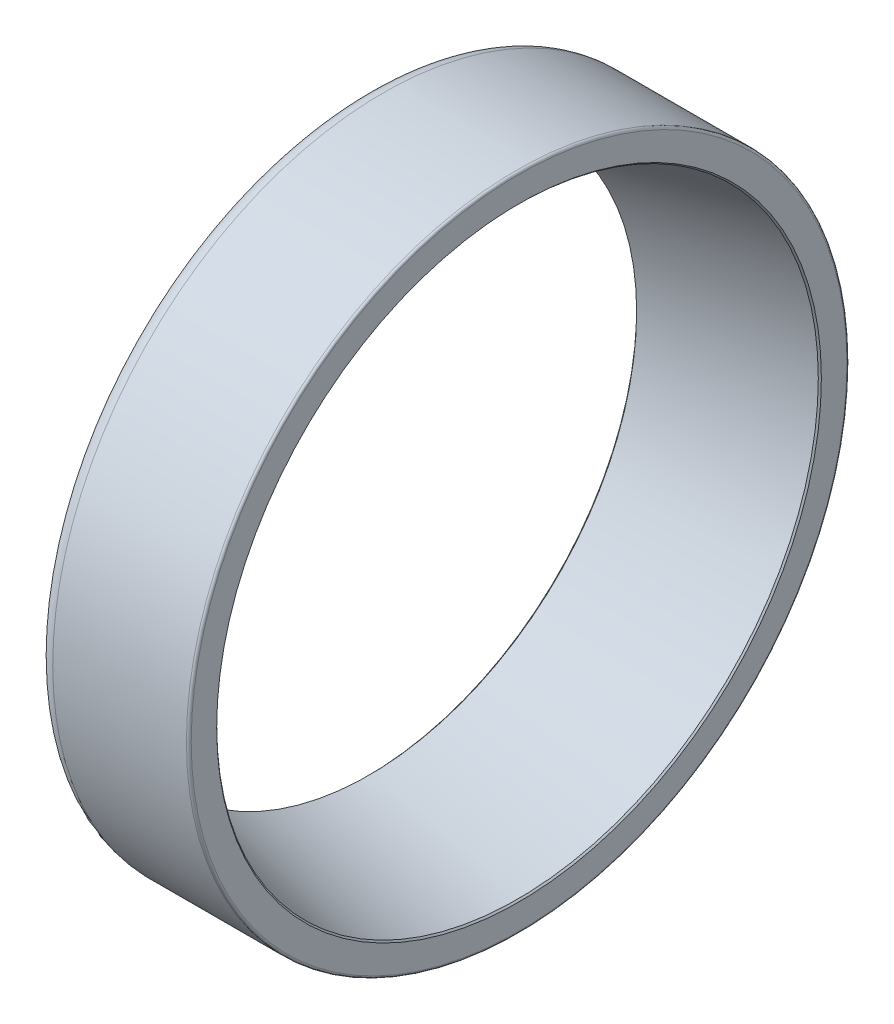
ISO-10303-21;
HEADER;
FILE_DESCRIPTION(('STEP AP214'),'2;1');
FILE_NAME('part.step','',(''),(''),'','','');
FILE_SCHEMA(('AUTOMOTIVE_DESIGN { 1 0 10303 214 1 1 1 1 }'));
ENDSEC;
DATA;
#1=APPLICATION_CONTEXT('core data for automotive mechanical design processes');
#2=APPLICATION_PROTOCOL_DEFINITION('international standard','automotive_design',2000,#1);
#3=PRODUCT_CONTEXT('',#1,'mechanical');
#4=PRODUCT('Part','Part','',(#3));
#5=PRODUCT_RELATED_PRODUCT_CATEGORY('part','',(#4));
#6=PRODUCT_DEFINITION_FORMATION('','',#4);
#7=PRODUCT_DEFINITION_CONTEXT('part definition',#1,'design');
#8=PRODUCT_DEFINITION('design','',#6,#7);
#9=PRODUCT_DEFINITION_SHAPE('','',#8);
#10=(LENGTH_UNIT() NAMED_UNIT(*) SI_UNIT(.MILLI.,.METRE.));
#11=(NAMED_UNIT(*) PLANE_ANGLE_UNIT() SI_UNIT($,.RADIAN.));
#12=(NAMED_UNIT(*) SI_UNIT($,.STERADIAN.) SOLID_ANGLE_UNIT());
#13=UNCERTAINTY_MEASURE_WITH_UNIT(LENGTH_MEASURE(1.E-05),#10,'distance_accuracy_value','');
#14=(GEOMETRIC_REPRESENTATION_CONTEXT(3) GLOBAL_UNCERTAINTY_ASSIGNED_CONTEXT((#13)) GLOBAL_UNIT_ASSIGNED_CONTEXT((#10,
#11,#12)) REPRESENTATION_CONTEXT('',''));
#15=CARTESIAN_POINT('',(0.,0.,0.));
#16=DIRECTION('',(0.,0.,1.));
#17=DIRECTION('',(1.,0.,0.));
#18=AXIS2_PLACEMENT_3D('',#15,#16,#17);
#19=CARTESIAN_POINT('',(18.9209032866378,-2.22044604925031E-13,0.));
#20=DIRECTION('',(1.,0.,0.));
#21=DIRECTION('',(0.,0.,-1.));
#22=AXIS2_PLACEMENT_3D('',#19,#20,#21);
#23=CONICAL_SURFACE('',#22,37.829903286638,0.219588317783418);
#24=CARTESIAN_POINT('',(0.245260906757583,-2.22044604925031E-13,0.));
#25=DIRECTION('',(-1.,0.,0.));
#26=DIRECTION('',(0.,0.,1.));
#27=AXIS2_PLACEMENT_3D('',#24,#25,#26);
#28=CIRCLE('',#27,33.661739093242);
#29=CARTESIAN_POINT('',(0.245260906757588,-2.36059119096372E-13,33.661739093242));
#30=VERTEX_POINT('',#29);
#31=EDGE_CURVE('E65',#30,#30,#28,.T.);
#32=ORIENTED_EDGE('',*,*,#31,.T.);
#33=EDGE_LOOP('',(#32));
#34=FACE_BOUND('',#33,.T.);
#35=CARTESIAN_POINT('',(18.9209032866378,-2.22044604925031E-13,0.));
#36=DIRECTION('',(1.,0.,0.));
#37=DIRECTION('',(0.,0.,-1.));
#38=AXIS2_PLACEMENT_3D('',#35,#36,#37);
#39=CIRCLE('',#38,37.829903286638);
#40=CARTESIAN_POINT('',(18.9209032866378,-2.06294743806968E-13,-37.829903286638));
#41=VERTEX_POINT('',#40);
#42=EDGE_CURVE('E203',#41,#41,#39,.T.);
#43=ORIENTED_EDGE('',*,*,#42,.T.);
#44=EDGE_LOOP('',(#43));
#45=FACE_BOUND('',#44,.T.);
#46=ADVANCED_FACE('F17',(#34,#45),#23,.F.);
#47=CARTESIAN_POINT('',(19.1139999999999,0.,2.22044604925031E-13));
#48=DIRECTION('',(1.,0.,0.));
#49=DIRECTION('',(0.,0.,-1.));
#50=AXIS2_PLACEMENT_3D('',#47,#48,#49);
#51=CONICAL_SURFACE('',#50,38.023,0.785398163397448);
#52=CARTESIAN_POINT('',(19.1139999999999,0.,2.22044604925031E-13));
#53=DIRECTION('',(1.,0.,0.));
#54=DIRECTION('',(0.,0.,-1.));
#55=AXIS2_PLACEMENT_3D('',#52,#53,#54);
#56=CIRCLE('',#55,38.023);
#57=CARTESIAN_POINT('',(19.1139999999998,0.,-38.0229999999998));
#58=VERTEX_POINT('',#57);
#59=EDGE_CURVE('E205',#58,#58,#56,.T.);
#60=ORIENTED_EDGE('',*,*,#59,.T.);
#61=EDGE_LOOP('',(#60));
#62=FACE_BOUND('',#61,.T.);
#63=ORIENTED_EDGE('',*,*,#42,.F.);
#64=EDGE_LOOP('',(#63));
#65=FACE_BOUND('',#64,.T.);
#66=ADVANCED_FACE('F155',(#62,#65),#51,.F.);
#67=CARTESIAN_POINT('',(0.,0.,0.));
#68=DIRECTION('',(-1.,0.,0.));
#69=DIRECTION('',(0.,0.,1.));
#70=AXIS2_PLACEMENT_3D('',#67,#68,#69);
#71=CONICAL_SURFACE('',#70,33.907,0.785398163397632);
#72=ORIENTED_EDGE('',*,*,#31,.F.);
#73=EDGE_LOOP('',(#72));
#74=FACE_BOUND('',#73,.T.);
#75=CARTESIAN_POINT('',(0.,0.,0.));
#76=DIRECTION('',(-1.,0.,0.));
#77=DIRECTION('',(0.,0.,1.));
#78=AXIS2_PLACEMENT_3D('',#75,#76,#77);
#79=CIRCLE('',#78,33.907);
#80=CARTESIAN_POINT('',(0.,0.,33.907));
#81=VERTEX_POINT('',#80);
#82=EDGE_CURVE('E52',#81,#81,#79,.T.);
#83=ORIENTED_EDGE('',*,*,#82,.T.);
#84=EDGE_LOOP('',(#83));
#85=FACE_BOUND('',#84,.T.);
#86=ADVANCED_FACE('F148',(#74,#85),#71,.F.);
#87=CARTESIAN_POINT('',(19.1139999999995,38.0230000000001,6.66133814775094E-13));
#88=DIRECTION('',(-1.,0.,0.));
#89=DIRECTION('',(0.,0.,1.));
#90=AXIS2_PLACEMENT_3D('',#87,#88,#89);
#91=PLANE('',#90);
#92=ORIENTED_EDGE('',*,*,#59,.F.);
#93=EDGE_LOOP('',(#92));
#94=FACE_BOUND('',#93,.T.);
#95=CARTESIAN_POINT('',(19.1139999999994,0.,2.22110683733828E-13));
#96=DIRECTION('',(-1.,0.,0.));
#97=DIRECTION('',(0.,0.,-1.));
#98=AXIS2_PLACEMENT_3D('',#95,#96,#97);
#99=CIRCLE('',#98,41.2289999999996);
#100=CARTESIAN_POINT('',(19.1139999999999,2.22044604925031E-13,-41.229));
#101=VERTEX_POINT('',#100);
#102=CARTESIAN_POINT('',(19.1139999999996,6.66133814775094E-13,41.2290000000002));
#103=VERTEX_POINT('',#102);
#104=EDGE_CURVE('E48',#101,#103,#99,.T.);
#105=ORIENTED_EDGE('',*,*,#104,.F.);
#106=CARTESIAN_POINT('',(19.1139999999994,0.,2.22110683733828E-13));
#107=DIRECTION('',(-1.,0.,0.));
#108=DIRECTION('',(0.,0.,1.));
#109=AXIS2_PLACEMENT_3D('',#106,#107,#108);
#110=CIRCLE('',#109,41.2289999999997);
#111=EDGE_CURVE('E45',#103,#101,#110,.T.);
#112=ORIENTED_EDGE('',*,*,#111,.F.);
#113=EDGE_LOOP('',(#105,#112));
#114=FACE_BOUND('',#113,.T.);
#115=ADVANCED_FACE('F50',(#94,#114),#91,.F.);
#116=CARTESIAN_POINT('',(-1.11022302462516E-13,39.5290000000001,2.22044604925031E-13));
#117=DIRECTION('',(1.,0.,0.));
#118=DIRECTION('',(0.,0.,-1.));
#119=AXIS2_PLACEMENT_3D('',#116,#117,#118);
#120=PLANE('',#119);
#121=CARTESIAN_POINT('',(-3.92914867308747E-13,0.,0.));
#122=DIRECTION('',(1.,0.,0.));
#123=DIRECTION('',(0.,0.,1.));
#124=AXIS2_PLACEMENT_3D('',#121,#122,#123);
#125=CIRCLE('',#124,39.5290000000001);
#126=CARTESIAN_POINT('',(-6.66133814775094E-13,4.44089209850063E-13,39.5290000000001));
#127=VERTEX_POINT('',#126);
#128=CARTESIAN_POINT('',(-2.22044604925031E-13,6.66133814775094E-13,-39.5289999999997));
#129=VERTEX_POINT('',#128);
#130=EDGE_CURVE('E36',#127,#129,#125,.T.);
#131=ORIENTED_EDGE('',*,*,#130,.F.);
#132=CARTESIAN_POINT('',(-3.94649590784724E-13,0.,0.));
#133=DIRECTION('',(1.,0.,0.));
#134=DIRECTION('',(0.,0.,-1.));
#135=AXIS2_PLACEMENT_3D('',#132,#133,#134);
#136=CIRCLE('',#135,39.529);
#137=EDGE_CURVE('E56',#129,#127,#136,.T.);
#138=ORIENTED_EDGE('',*,*,#137,.F.);
#139=EDGE_LOOP('',(#131,#138));
#140=FACE_BOUND('',#139,.T.);
#141=ORIENTED_EDGE('',*,*,#82,.F.);
#142=EDGE_LOOP('',(#141));
#143=FACE_BOUND('',#142,.T.);
#144=ADVANCED_FACE('F78',(#140,#143),#120,.F.);
#145=CARTESIAN_POINT('',(18.8139999999996,0.,2.22044604925031E-13));
#146=DIRECTION('',(-1.,0.,0.));
#147=DIRECTION('',(0.,0.,1.));
#148=AXIS2_PLACEMENT_3D('',#145,#146,#147);
#149=TOROIDAL_SURFACE('',#148,41.2289999999997,0.299999999999882);
#150=CARTESIAN_POINT('',(18.814,0.,-2.22044604925031E-13));
#151=DIRECTION('',(-1.,0.,0.));
#152=DIRECTION('',(0.,0.,1.));
#153=AXIS2_PLACEMENT_3D('',#150,#151,#152);
#154=CIRCLE('',#153,41.529);
#155=CARTESIAN_POINT('',(18.814,0.,41.5289999999998));
#156=VERTEX_POINT('',#155);
#157=EDGE_CURVE('E28',#156,#156,#154,.T.);
#158=ORIENTED_EDGE('',*,*,#157,.F.);
#159=EDGE_LOOP('',(#158));
#160=FACE_BOUND('',#159,.T.);
#161=ORIENTED_EDGE('',*,*,#111,.T.);
#162=ORIENTED_EDGE('',*,*,#104,.T.);
#163=EDGE_LOOP('',(#161,#162));
#164=FACE_BOUND('',#163,.T.);
#165=ADVANCED_FACE('F55',(#160,#164),#149,.T.);
#166=CARTESIAN_POINT('',(1.99999999999979,0.,0.));
#167=DIRECTION('',(-1.,0.,0.));
#168=DIRECTION('',(0.,0.,1.));
#169=AXIS2_PLACEMENT_3D('',#166,#167,#168);
#170=TOROIDAL_SURFACE('',#169,39.5289999999999,2.00000000000017);
#171=ORIENTED_EDGE('',*,*,#130,.T.);
#172=ORIENTED_EDGE('',*,*,#137,.T.);
#173=EDGE_LOOP('',(#171,#172));
#174=FACE_BOUND('',#173,.T.);
#175=CARTESIAN_POINT('',(1.99999999999989,0.,0.));
#176=DIRECTION('',(-1.,0.,0.));
#177=DIRECTION('',(0.,0.,1.));
#178=AXIS2_PLACEMENT_3D('',#175,#176,#177);
#179=CIRCLE('',#178,41.529);
#180=CARTESIAN_POINT('',(1.9999999999999,0.,41.529));
#181=VERTEX_POINT('',#180);
#182=EDGE_CURVE('E11',#181,#181,#179,.F.);
#183=ORIENTED_EDGE('',*,*,#182,.F.);
#184=EDGE_LOOP('',(#183));
#185=FACE_BOUND('',#184,.T.);
#186=ADVANCED_FACE('F77',(#174,#185),#170,.T.);
#187=CARTESIAN_POINT('',(19.1139999999999,0.,2.22044604925031E-13));
#188=DIRECTION('',(-1.,0.,0.));
#189=DIRECTION('',(0.,0.,1.));
#190=AXIS2_PLACEMENT_3D('',#187,#188,#189);
#191=CYLINDRICAL_SURFACE('',#190,41.529);
#192=ORIENTED_EDGE('',*,*,#182,.T.);
#193=EDGE_LOOP('',(#192));
#194=FACE_BOUND('',#193,.T.);
#195=ORIENTED_EDGE('',*,*,#157,.T.);
#196=EDGE_LOOP('',(#195));
#197=FACE_BOUND('',#196,.T.);
#198=ADVANCED_FACE('F120',(#194,#197),#191,.T.);
#199=CLOSED_SHELL('',(#46,#66,#86,#115,#144,#165,#186,#198));
#200=MANIFOLD_SOLID_BREP('B1',#199);
#201=ADVANCED_BREP_SHAPE_REPRESENTATION('',(#18,#200),#14);
#202=SHAPE_DEFINITION_REPRESENTATION(#9,#201);
ENDSEC;
END-ISO-10303-21;
